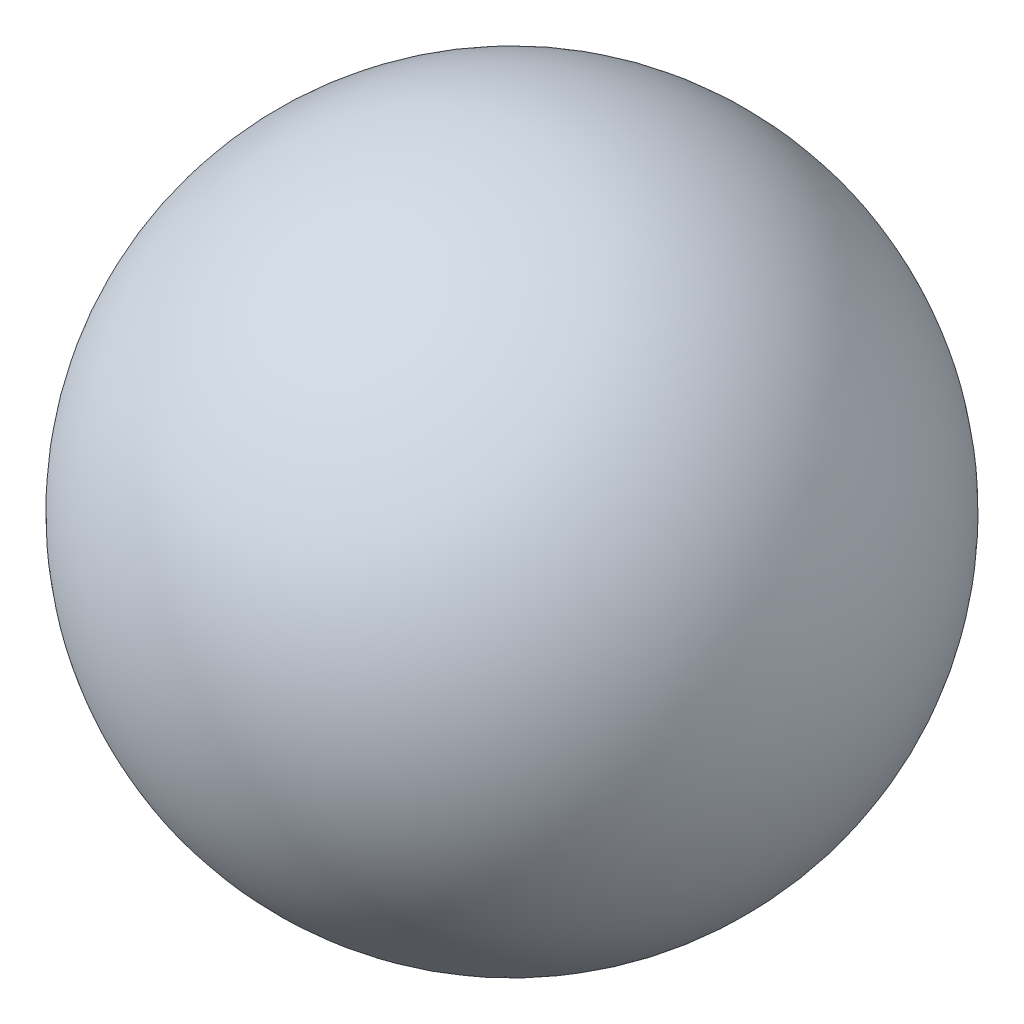
ISO-10303-21;
HEADER;
FILE_DESCRIPTION(('STEP AP214'),'2;1');
FILE_NAME('part.step','',(''),(''),'','','');
FILE_SCHEMA(('AUTOMOTIVE_DESIGN { 1 0 10303 214 1 1 1 1 }'));
ENDSEC;
DATA;
#1=APPLICATION_CONTEXT('core data for automotive mechanical design processes');
#2=APPLICATION_PROTOCOL_DEFINITION('international standard','automotive_design',2000,#1);
#3=PRODUCT_CONTEXT('',#1,'mechanical');
#4=PRODUCT('Part','Part','',(#3));
#5=PRODUCT_RELATED_PRODUCT_CATEGORY('part','',(#4));
#6=PRODUCT_DEFINITION_FORMATION('','',#4);
#7=PRODUCT_DEFINITION_CONTEXT('part definition',#1,'design');
#8=PRODUCT_DEFINITION('design','',#6,#7);
#9=PRODUCT_DEFINITION_SHAPE('','',#8);
#10=(LENGTH_UNIT() NAMED_UNIT(*) SI_UNIT(.MILLI.,.METRE.));
#11=(NAMED_UNIT(*) PLANE_ANGLE_UNIT() SI_UNIT($,.RADIAN.));
#12=(NAMED_UNIT(*) SI_UNIT($,.STERADIAN.) SOLID_ANGLE_UNIT());
#13=UNCERTAINTY_MEASURE_WITH_UNIT(LENGTH_MEASURE(1.E-05),#10,'distance_accuracy_value','');
#14=(GEOMETRIC_REPRESENTATION_CONTEXT(3) GLOBAL_UNCERTAINTY_ASSIGNED_CONTEXT((#13)) GLOBAL_UNIT_ASSIGNED_CONTEXT((#10,
#11,#12)) REPRESENTATION_CONTEXT('',''));
#15=CARTESIAN_POINT('',(0.,0.,0.));
#16=DIRECTION('',(0.,0.,1.));
#17=DIRECTION('',(1.,0.,0.));
#18=AXIS2_PLACEMENT_3D('',#15,#16,#17);
#19=CARTESIAN_POINT('',(0.,0.,0.));
#20=DIRECTION('',(0.,0.,-1.));
#21=DIRECTION('',(1.,0.,0.));
#22=AXIS2_PLACEMENT_3D('',#19,#20,#21);
#23=SPHERICAL_SURFACE('',#22,15.);
#24=CARTESIAN_POINT('',(0.,0.,-15.));
#25=VERTEX_POINT('',#24);
#26=VERTEX_LOOP('',#25);
#27=FACE_BOUND('',#26,.T.);
#28=ADVANCED_FACE('F33',(#27),#23,.T.);
#29=CLOSED_SHELL('',(#28));
#30=MANIFOLD_SOLID_BREP('B2',#29);
#31=ADVANCED_BREP_SHAPE_REPRESENTATION('',(#18,#30),#14);
#32=SHAPE_DEFINITION_REPRESENTATION(#9,#31);
ENDSEC;
END-ISO-10303-21;
